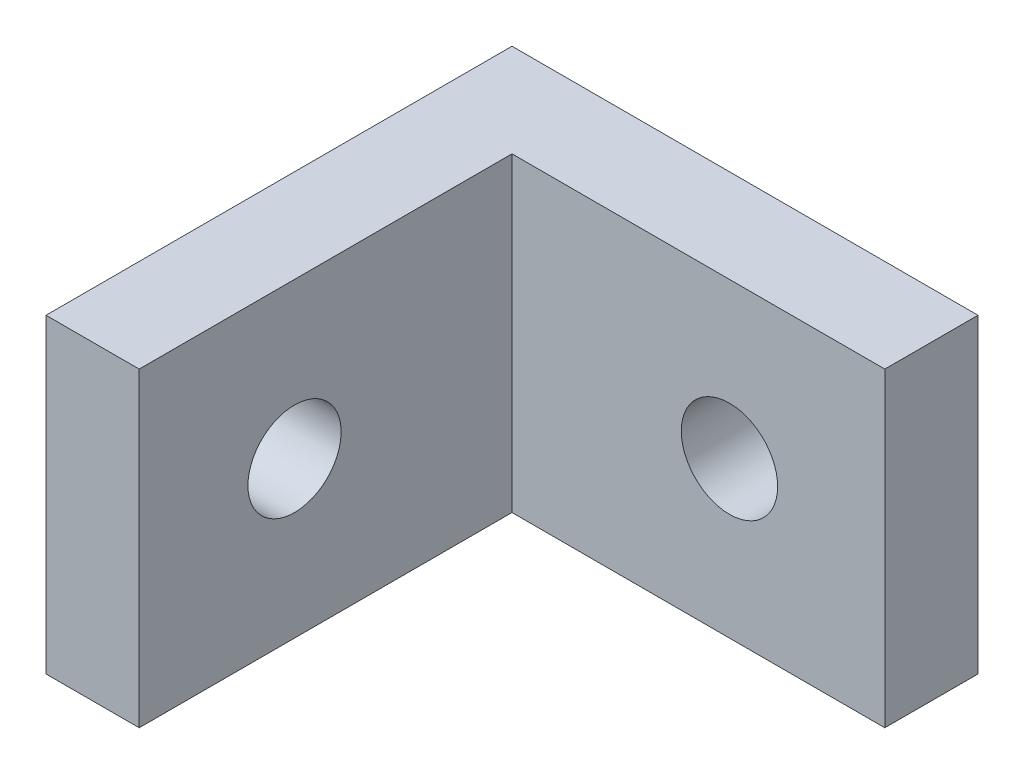
ISO-10303-21;
HEADER;
FILE_DESCRIPTION(('STEP AP214'),'2;1');
FILE_NAME('part.step','',(''),(''),'','','');
FILE_SCHEMA(('AUTOMOTIVE_DESIGN { 1 0 10303 214 1 1 1 1 }'));
ENDSEC;
DATA;
#1=APPLICATION_CONTEXT('core data for automotive mechanical design processes');
#2=APPLICATION_PROTOCOL_DEFINITION('international standard','automotive_design',2000,#1);
#3=PRODUCT_CONTEXT('',#1,'mechanical');
#4=PRODUCT('Part','Part','',(#3));
#5=PRODUCT_RELATED_PRODUCT_CATEGORY('part','',(#4));
#6=PRODUCT_DEFINITION_FORMATION('','',#4);
#7=PRODUCT_DEFINITION_CONTEXT('part definition',#1,'design');
#8=PRODUCT_DEFINITION('design','',#6,#7);
#9=PRODUCT_DEFINITION_SHAPE('','',#8);
#10=(LENGTH_UNIT() NAMED_UNIT(*) SI_UNIT(.MILLI.,.METRE.));
#11=(NAMED_UNIT(*) PLANE_ANGLE_UNIT() SI_UNIT($,.RADIAN.));
#12=(NAMED_UNIT(*) SI_UNIT($,.STERADIAN.) SOLID_ANGLE_UNIT());
#13=UNCERTAINTY_MEASURE_WITH_UNIT(LENGTH_MEASURE(1.E-05),#10,'distance_accuracy_value','');
#14=(GEOMETRIC_REPRESENTATION_CONTEXT(3) GLOBAL_UNCERTAINTY_ASSIGNED_CONTEXT((#13)) GLOBAL_UNIT_ASSIGNED_CONTEXT((#10,
#11,#12)) REPRESENTATION_CONTEXT('',''));
#15=CARTESIAN_POINT('',(0.,0.,0.));
#16=DIRECTION('',(0.,0.,1.));
#17=DIRECTION('',(1.,0.,0.));
#18=AXIS2_PLACEMENT_3D('',#15,#16,#17);
#19=CARTESIAN_POINT('',(-7.5,-5.,3.));
#20=DIRECTION('',(1.,0.,0.));
#21=DIRECTION('',(0.,0.,-1.));
#22=AXIS2_PLACEMENT_3D('',#19,#20,#21);
#23=PLANE('',#22);
#24=CARTESIAN_POINT('',(-7.5,0.,10.));
#25=DIRECTION('',(-1.,0.,0.));
#26=DIRECTION('',(0.,0.,1.));
#27=AXIS2_PLACEMENT_3D('',#24,#25,#26);
#28=CIRCLE('',#27,1.5);
#29=CARTESIAN_POINT('',(-7.5,0.,11.5));
#30=VERTEX_POINT('',#29);
#31=EDGE_CURVE('E191',#30,#30,#28,.T.);
#32=ORIENTED_EDGE('',*,*,#31,.F.);
#33=EDGE_LOOP('',(#32));
#34=FACE_BOUND('',#33,.T.);
#35=DIRECTION('',(0.,-1.,0.));
#36=VECTOR('',#35,1.);
#37=CARTESIAN_POINT('',(-7.5,-5.,0.));
#38=LINE('',#37,#36);
#39=CARTESIAN_POINT('',(-7.5,5.,0.));
#40=VERTEX_POINT('',#39);
#41=CARTESIAN_POINT('',(-7.5,-5.,0.));
#42=VERTEX_POINT('',#41);
#43=EDGE_CURVE('E104',#40,#42,#38,.T.);
#44=ORIENTED_EDGE('',*,*,#43,.T.);
#45=DIRECTION('',(0.,0.,-1.));
#46=VECTOR('',#45,1.);
#47=CARTESIAN_POINT('',(-7.5,-5.,3.));
#48=LINE('',#47,#46);
#49=CARTESIAN_POINT('',(-7.5,-5.,15.));
#50=VERTEX_POINT('',#49);
#51=EDGE_CURVE('E11',#50,#42,#48,.T.);
#52=ORIENTED_EDGE('',*,*,#51,.F.);
#53=DIRECTION('',(0.,-1.,0.));
#54=VECTOR('',#53,1.);
#55=CARTESIAN_POINT('',(-7.5,5.,15.));
#56=LINE('',#55,#54);
#57=CARTESIAN_POINT('',(-7.5,5.,15.));
#58=VERTEX_POINT('',#57);
#59=EDGE_CURVE('E106',#58,#50,#56,.T.);
#60=ORIENTED_EDGE('',*,*,#59,.F.);
#61=DIRECTION('',(0.,0.,-1.));
#62=VECTOR('',#61,1.);
#63=CARTESIAN_POINT('',(-7.5,5.,3.));
#64=LINE('',#63,#62);
#65=EDGE_CURVE('E89',#58,#40,#64,.T.);
#66=ORIENTED_EDGE('',*,*,#65,.T.);
#67=EDGE_LOOP('',(#44,#52,#60,#66));
#68=FACE_BOUND('',#67,.T.);
#69=ADVANCED_FACE('F43',(#34,#68),#23,.F.);
#70=CARTESIAN_POINT('',(7.5,-5.,3.));
#71=DIRECTION('',(0.,1.,0.));
#72=DIRECTION('',(0.,0.,1.));
#73=AXIS2_PLACEMENT_3D('',#70,#71,#72);
#74=PLANE('',#73);
#75=DIRECTION('',(1.,0.,0.));
#76=VECTOR('',#75,1.);
#77=CARTESIAN_POINT('',(7.5,-5.,0.));
#78=LINE('',#77,#76);
#79=CARTESIAN_POINT('',(7.5,-5.,0.));
#80=VERTEX_POINT('',#79);
#81=EDGE_CURVE('E111',#42,#80,#78,.T.);
#82=ORIENTED_EDGE('',*,*,#81,.T.);
#83=DIRECTION('',(0.,0.,-1.));
#84=VECTOR('',#83,1.);
#85=CARTESIAN_POINT('',(7.5,-5.,3.));
#86=LINE('',#85,#84);
#87=CARTESIAN_POINT('',(7.5,-5.,3.));
#88=VERTEX_POINT('',#87);
#89=EDGE_CURVE('E52',#88,#80,#86,.T.);
#90=ORIENTED_EDGE('',*,*,#89,.F.);
#91=DIRECTION('',(1.,0.,0.));
#92=VECTOR('',#91,1.);
#93=CARTESIAN_POINT('',(7.5,-5.,3.));
#94=LINE('',#93,#92);
#95=CARTESIAN_POINT('',(-4.49999999999999,-5.,3.));
#96=VERTEX_POINT('',#95);
#97=EDGE_CURVE('E97',#96,#88,#94,.T.);
#98=ORIENTED_EDGE('',*,*,#97,.F.);
#99=DIRECTION('',(0.,0.,-1.));
#100=VECTOR('',#99,1.);
#101=CARTESIAN_POINT('',(-4.5,-5.,15.));
#102=LINE('',#101,#100);
#103=CARTESIAN_POINT('',(-4.5,-5.,15.));
#104=VERTEX_POINT('',#103);
#105=EDGE_CURVE('E113',#104,#96,#102,.T.);
#106=ORIENTED_EDGE('',*,*,#105,.F.);
#107=DIRECTION('',(1.,0.,0.));
#108=VECTOR('',#107,1.);
#109=CARTESIAN_POINT('',(-7.5,-5.,15.));
#110=LINE('',#109,#108);
#111=EDGE_CURVE('E139',#50,#104,#110,.T.);
#112=ORIENTED_EDGE('',*,*,#111,.F.);
#113=ORIENTED_EDGE('',*,*,#51,.T.);
#114=EDGE_LOOP('',(#82,#90,#98,#106,#112,#113));
#115=FACE_BOUND('',#114,.T.);
#116=ADVANCED_FACE('F134',(#115),#74,.F.);
#117=CARTESIAN_POINT('',(7.5,-5.,3.));
#118=DIRECTION('',(-1.,0.,0.));
#119=DIRECTION('',(0.,0.,1.));
#120=AXIS2_PLACEMENT_3D('',#117,#118,#119);
#121=PLANE('',#120);
#122=DIRECTION('',(0.,1.,0.));
#123=VECTOR('',#122,1.);
#124=CARTESIAN_POINT('',(7.5,-5.,0.));
#125=LINE('',#124,#123);
#126=CARTESIAN_POINT('',(7.5,5.,0.));
#127=VERTEX_POINT('',#126);
#128=EDGE_CURVE('E98',#80,#127,#125,.T.);
#129=ORIENTED_EDGE('',*,*,#128,.T.);
#130=DIRECTION('',(0.,0.,-1.));
#131=VECTOR('',#130,1.);
#132=CARTESIAN_POINT('',(7.5,5.,3.));
#133=LINE('',#132,#131);
#134=CARTESIAN_POINT('',(7.5,5.,3.));
#135=VERTEX_POINT('',#134);
#136=EDGE_CURVE('E92',#135,#127,#133,.T.);
#137=ORIENTED_EDGE('',*,*,#136,.F.);
#138=DIRECTION('',(0.,1.,0.));
#139=VECTOR('',#138,1.);
#140=CARTESIAN_POINT('',(7.5,-5.,3.));
#141=LINE('',#140,#139);
#142=EDGE_CURVE('E65',#88,#135,#141,.T.);
#143=ORIENTED_EDGE('',*,*,#142,.F.);
#144=ORIENTED_EDGE('',*,*,#89,.T.);
#145=EDGE_LOOP('',(#129,#137,#143,#144));
#146=FACE_BOUND('',#145,.T.);
#147=ADVANCED_FACE('F132',(#146),#121,.F.);
#148=CARTESIAN_POINT('',(7.5,5.,3.));
#149=DIRECTION('',(0.,-1.,0.));
#150=DIRECTION('',(0.,0.,-1.));
#151=AXIS2_PLACEMENT_3D('',#148,#149,#150);
#152=PLANE('',#151);
#153=DIRECTION('',(-1.,0.,0.));
#154=VECTOR('',#153,1.);
#155=CARTESIAN_POINT('',(7.5,5.,0.));
#156=LINE('',#155,#154);
#157=EDGE_CURVE('E85',#127,#40,#156,.T.);
#158=ORIENTED_EDGE('',*,*,#157,.T.);
#159=ORIENTED_EDGE('',*,*,#65,.F.);
#160=DIRECTION('',(-1.,0.,0.));
#161=VECTOR('',#160,1.);
#162=CARTESIAN_POINT('',(-7.5,5.,15.));
#163=LINE('',#162,#161);
#164=CARTESIAN_POINT('',(-4.5,5.,15.));
#165=VERTEX_POINT('',#164);
#166=EDGE_CURVE('E153',#165,#58,#163,.T.);
#167=ORIENTED_EDGE('',*,*,#166,.F.);
#168=DIRECTION('',(0.,0.,-1.));
#169=VECTOR('',#168,1.);
#170=CARTESIAN_POINT('',(-4.5,5.,15.));
#171=LINE('',#170,#169);
#172=CARTESIAN_POINT('',(-4.5,5.,3.));
#173=VERTEX_POINT('',#172);
#174=EDGE_CURVE('E119',#165,#173,#171,.T.);
#175=ORIENTED_EDGE('',*,*,#174,.T.);
#176=DIRECTION('',(-1.,0.,0.));
#177=VECTOR('',#176,1.);
#178=CARTESIAN_POINT('',(7.5,5.,3.));
#179=LINE('',#178,#177);
#180=EDGE_CURVE('E108',#135,#173,#179,.T.);
#181=ORIENTED_EDGE('',*,*,#180,.F.);
#182=ORIENTED_EDGE('',*,*,#136,.T.);
#183=EDGE_LOOP('',(#158,#159,#167,#175,#181,#182));
#184=FACE_BOUND('',#183,.T.);
#185=ADVANCED_FACE('F87',(#184),#152,.F.);
#186=CARTESIAN_POINT('',(0.,0.,3.));
#187=DIRECTION('',(0.,0.,1.));
#188=DIRECTION('',(1.,0.,0.));
#189=AXIS2_PLACEMENT_3D('',#186,#187,#188);
#190=PLANE('',#189);
#191=CARTESIAN_POINT('',(2.5,0.,3.));
#192=DIRECTION('',(0.,0.,1.));
#193=DIRECTION('',(1.,0.,0.));
#194=AXIS2_PLACEMENT_3D('',#191,#192,#193);
#195=CIRCLE('',#194,1.55);
#196=CARTESIAN_POINT('',(4.05,0.,3.));
#197=VERTEX_POINT('',#196);
#198=EDGE_CURVE('E166',#197,#197,#195,.T.);
#199=ORIENTED_EDGE('',*,*,#198,.F.);
#200=EDGE_LOOP('',(#199));
#201=FACE_BOUND('',#200,.T.);
#202=DIRECTION('',(0.,1.,0.));
#203=VECTOR('',#202,1.);
#204=CARTESIAN_POINT('',(-4.5,5.,3.));
#205=LINE('',#204,#203);
#206=EDGE_CURVE('E59',#96,#173,#205,.T.);
#207=ORIENTED_EDGE('',*,*,#206,.F.);
#208=ORIENTED_EDGE('',*,*,#97,.T.);
#209=ORIENTED_EDGE('',*,*,#142,.T.);
#210=ORIENTED_EDGE('',*,*,#180,.T.);
#211=EDGE_LOOP('',(#207,#208,#209,#210));
#212=FACE_BOUND('',#211,.T.);
#213=ADVANCED_FACE('F171',(#201,#212),#190,.T.);
#214=CARTESIAN_POINT('',(0.,0.,0.));
#215=DIRECTION('',(0.,0.,1.));
#216=DIRECTION('',(1.,0.,0.));
#217=AXIS2_PLACEMENT_3D('',#214,#215,#216);
#218=PLANE('',#217);
#219=CARTESIAN_POINT('',(2.5,0.,0.));
#220=DIRECTION('',(0.,0.,-1.));
#221=DIRECTION('',(-1.,0.,0.));
#222=AXIS2_PLACEMENT_3D('',#219,#220,#221);
#223=CIRCLE('',#222,1.55);
#224=CARTESIAN_POINT('',(0.950000000000004,0.,0.));
#225=VERTEX_POINT('',#224);
#226=EDGE_CURVE('E197',#225,#225,#223,.T.);
#227=ORIENTED_EDGE('',*,*,#226,.F.);
#228=EDGE_LOOP('',(#227));
#229=FACE_BOUND('',#228,.T.);
#230=ORIENTED_EDGE('',*,*,#43,.F.);
#231=ORIENTED_EDGE('',*,*,#157,.F.);
#232=ORIENTED_EDGE('',*,*,#128,.F.);
#233=ORIENTED_EDGE('',*,*,#81,.F.);
#234=EDGE_LOOP('',(#230,#231,#232,#233));
#235=FACE_BOUND('',#234,.T.);
#236=ADVANCED_FACE('F110',(#229,#235),#218,.F.);
#237=CARTESIAN_POINT('',(-4.5,5.,15.));
#238=DIRECTION('',(-1.,0.,0.));
#239=DIRECTION('',(0.,-1.,0.));
#240=AXIS2_PLACEMENT_3D('',#237,#238,#239);
#241=PLANE('',#240);
#242=CARTESIAN_POINT('',(-4.5,0.,10.));
#243=DIRECTION('',(-1.,0.,0.));
#244=DIRECTION('',(0.,-1.,0.));
#245=AXIS2_PLACEMENT_3D('',#242,#243,#244);
#246=CIRCLE('',#245,1.5);
#247=CARTESIAN_POINT('',(-4.49999999999999,0.,11.5));
#248=VERTEX_POINT('',#247);
#249=EDGE_CURVE('E46',#248,#248,#246,.T.);
#250=ORIENTED_EDGE('',*,*,#249,.T.);
#251=EDGE_LOOP('',(#250));
#252=FACE_BOUND('',#251,.T.);
#253=ORIENTED_EDGE('',*,*,#206,.T.);
#254=ORIENTED_EDGE('',*,*,#174,.F.);
#255=DIRECTION('',(0.,1.,0.));
#256=VECTOR('',#255,1.);
#257=CARTESIAN_POINT('',(-4.5,5.,15.));
#258=LINE('',#257,#256);
#259=EDGE_CURVE('E150',#104,#165,#258,.T.);
#260=ORIENTED_EDGE('',*,*,#259,.F.);
#261=ORIENTED_EDGE('',*,*,#105,.T.);
#262=EDGE_LOOP('',(#253,#254,#260,#261));
#263=FACE_BOUND('',#262,.T.);
#264=ADVANCED_FACE('F158',(#252,#263),#241,.F.);
#265=CARTESIAN_POINT('',(0.,0.,15.));
#266=DIRECTION('',(0.,0.,1.));
#267=DIRECTION('',(1.,0.,0.));
#268=AXIS2_PLACEMENT_3D('',#265,#266,#267);
#269=PLANE('',#268);
#270=ORIENTED_EDGE('',*,*,#59,.T.);
#271=ORIENTED_EDGE('',*,*,#111,.T.);
#272=ORIENTED_EDGE('',*,*,#259,.T.);
#273=ORIENTED_EDGE('',*,*,#166,.T.);
#274=EDGE_LOOP('',(#270,#271,#272,#273));
#275=FACE_BOUND('',#274,.T.);
#276=ADVANCED_FACE('F152',(#275),#269,.T.);
#277=CARTESIAN_POINT('',(2.5,0.,15.));
#278=DIRECTION('',(0.,0.,-1.));
#279=DIRECTION('',(-1.,0.,0.));
#280=AXIS2_PLACEMENT_3D('',#277,#278,#279);
#281=CYLINDRICAL_SURFACE('',#280,1.55);
#282=ORIENTED_EDGE('',*,*,#198,.T.);
#283=EDGE_LOOP('',(#282));
#284=FACE_BOUND('',#283,.T.);
#285=ORIENTED_EDGE('',*,*,#226,.T.);
#286=EDGE_LOOP('',(#285));
#287=FACE_BOUND('',#286,.T.);
#288=ADVANCED_FACE('F208',(#284,#287),#281,.F.);
#289=CARTESIAN_POINT('',(7.5,0.,10.));
#290=DIRECTION('',(-1.,0.,0.));
#291=DIRECTION('',(0.,0.,1.));
#292=AXIS2_PLACEMENT_3D('',#289,#290,#291);
#293=CYLINDRICAL_SURFACE('',#292,1.5);
#294=CARTESIAN_POINT('',(-7.5,0.,11.5));
#295=CARTESIAN_POINT('',(-7.46875,0.,11.5));
#296=CARTESIAN_POINT('',(-7.4375,0.,11.5));
#297=CARTESIAN_POINT('',(-7.375,0.,11.5));
#298=CARTESIAN_POINT('',(-7.34375,0.,11.5));
#299=CARTESIAN_POINT('',(-7.28125,0.,11.5));
#300=CARTESIAN_POINT('',(-7.25,0.,11.5));
#301=CARTESIAN_POINT('',(-7.1875,0.,11.5));
#302=CARTESIAN_POINT('',(-7.15625,0.,11.5));
#303=CARTESIAN_POINT('',(-7.09375,0.,11.5));
#304=CARTESIAN_POINT('',(-7.0625,0.,11.5));
#305=CARTESIAN_POINT('',(-7.,0.,11.5));
#306=CARTESIAN_POINT('',(-6.96875,0.,11.5));
#307=CARTESIAN_POINT('',(-6.90625,0.,11.5));
#308=CARTESIAN_POINT('',(-6.875,0.,11.5));
#309=CARTESIAN_POINT('',(-6.8125,0.,11.5));
#310=CARTESIAN_POINT('',(-6.78125,0.,11.5));
#311=CARTESIAN_POINT('',(-6.71875,0.,11.5));
#312=CARTESIAN_POINT('',(-6.6875,0.,11.5));
#313=CARTESIAN_POINT('',(-6.625,0.,11.5));
#314=CARTESIAN_POINT('',(-6.59375,0.,11.5));
#315=CARTESIAN_POINT('',(-6.53125,0.,11.5));
#316=CARTESIAN_POINT('',(-6.5,0.,11.5));
#317=CARTESIAN_POINT('',(-6.4375,0.,11.5));
#318=CARTESIAN_POINT('',(-6.40625,0.,11.5));
#319=CARTESIAN_POINT('',(-6.34375,0.,11.5));
#320=CARTESIAN_POINT('',(-6.3125,0.,11.5));
#321=CARTESIAN_POINT('',(-6.25,0.,11.5));
#322=CARTESIAN_POINT('',(-6.21875,0.,11.5));
#323=CARTESIAN_POINT('',(-6.15625,0.,11.5));
#324=CARTESIAN_POINT('',(-6.125,0.,11.5));
#325=CARTESIAN_POINT('',(-6.0625,0.,11.5));
#326=CARTESIAN_POINT('',(-6.03125,0.,11.5));
#327=CARTESIAN_POINT('',(-5.96875,0.,11.5));
#328=CARTESIAN_POINT('',(-5.9375,0.,11.5));
#329=CARTESIAN_POINT('',(-5.875,0.,11.5));
#330=CARTESIAN_POINT('',(-5.84375,0.,11.5));
#331=CARTESIAN_POINT('',(-5.78125,0.,11.5));
#332=CARTESIAN_POINT('',(-5.75,0.,11.5));
#333=CARTESIAN_POINT('',(-5.6875,0.,11.5));
#334=CARTESIAN_POINT('',(-5.65625,0.,11.5));
#335=CARTESIAN_POINT('',(-5.59375,0.,11.5));
#336=CARTESIAN_POINT('',(-5.5625,0.,11.5));
#337=CARTESIAN_POINT('',(-5.5,0.,11.5));
#338=CARTESIAN_POINT('',(-5.46875,0.,11.5));
#339=CARTESIAN_POINT('',(-5.40625,0.,11.5));
#340=CARTESIAN_POINT('',(-5.375,0.,11.5));
#341=CARTESIAN_POINT('',(-5.3125,0.,11.5));
#342=CARTESIAN_POINT('',(-5.28125,0.,11.5));
#343=CARTESIAN_POINT('',(-5.21874999999999,0.,11.5));
#344=CARTESIAN_POINT('',(-5.18749999999999,0.,11.5));
#345=CARTESIAN_POINT('',(-5.12499999999999,0.,11.5));
#346=CARTESIAN_POINT('',(-5.09374999999999,0.,11.5));
#347=CARTESIAN_POINT('',(-5.03124999999999,0.,11.5));
#348=CARTESIAN_POINT('',(-4.99999999999999,0.,11.5));
#349=CARTESIAN_POINT('',(-4.93749999999999,0.,11.5));
#350=CARTESIAN_POINT('',(-4.90624999999999,0.,11.5));
#351=CARTESIAN_POINT('',(-4.84374999999999,0.,11.5));
#352=CARTESIAN_POINT('',(-4.81249999999999,0.,11.5));
#353=CARTESIAN_POINT('',(-4.74999999999999,0.,11.5));
#354=CARTESIAN_POINT('',(-4.71874999999999,0.,11.5));
#355=CARTESIAN_POINT('',(-4.65624999999999,0.,11.5));
#356=CARTESIAN_POINT('',(-4.62499999999999,0.,11.5));
#357=CARTESIAN_POINT('',(-4.56249999999999,0.,11.5));
#358=CARTESIAN_POINT('',(-4.53124999999999,0.,11.5));
#359=CARTESIAN_POINT('',(-4.49999999999999,0.,11.5));
#360=B_SPLINE_CURVE_WITH_KNOTS('',3,(#294,#295,#296,#297,#298,#299,#300,#301,#302,#303,#304,
#305,#306,#307,#308,#309,#310,#311,#312,#313,#314,#315,#316,#317,#318,#319,#320,#321,#322,#323,
#324,#325,#326,#327,#328,#329,#330,#331,#332,#333,#334,#335,#336,#337,#338,#339,#340,#341,#342,
#343,#344,#345,#346,#347,#348,#349,#350,#351,#352,#353,#354,#355,#356,#357,#358,#359),
.UNSPECIFIED.,.F.,.F.,(4,2,2,2,2,2,2,2,2,2,2,2,2,2,2,2,2,2,2,2,2,2,2,2,2,2,2,2,2,2,2,2,4),(0.,
0.0937500000000001,0.1875,0.28125,0.375,0.46875,0.5625,0.656250000000001,0.750000000000001,
0.843750000000001,0.937500000000001,1.03125,1.125,1.21875,1.3125,1.40625,1.5,1.59375,1.6875,
1.78125,1.875,1.96875,2.0625,2.15625,2.25,2.34375,2.4375,2.53125,2.625,2.71875,2.8125,2.90625,
3.),.UNSPECIFIED.);
#361=EDGE_CURVE('BSEAM211',#30,#248,#360,.T.);
#362=ORIENTED_EDGE('',*,*,#31,.T.);
#363=ORIENTED_EDGE('',*,*,#249,.F.);
#364=ORIENTED_EDGE('',*,*,#361,.T.);
#365=ORIENTED_EDGE('',*,*,#361,.F.);
#366=EDGE_LOOP('',(#362,#364,#363,#365));
#367=FACE_BOUND('',#366,.T.);
#368=ADVANCED_FACE('F211',(#367),#293,.F.);
#369=CLOSED_SHELL('',(#69,#116,#147,#185,#213,#236,#264,#276,#288,#368));
#370=MANIFOLD_SOLID_BREP('B2',#369);
#371=ADVANCED_BREP_SHAPE_REPRESENTATION('',(#18,#370),#14);
#372=SHAPE_DEFINITION_REPRESENTATION(#9,#371);
ENDSEC;
END-ISO-10303-21;
